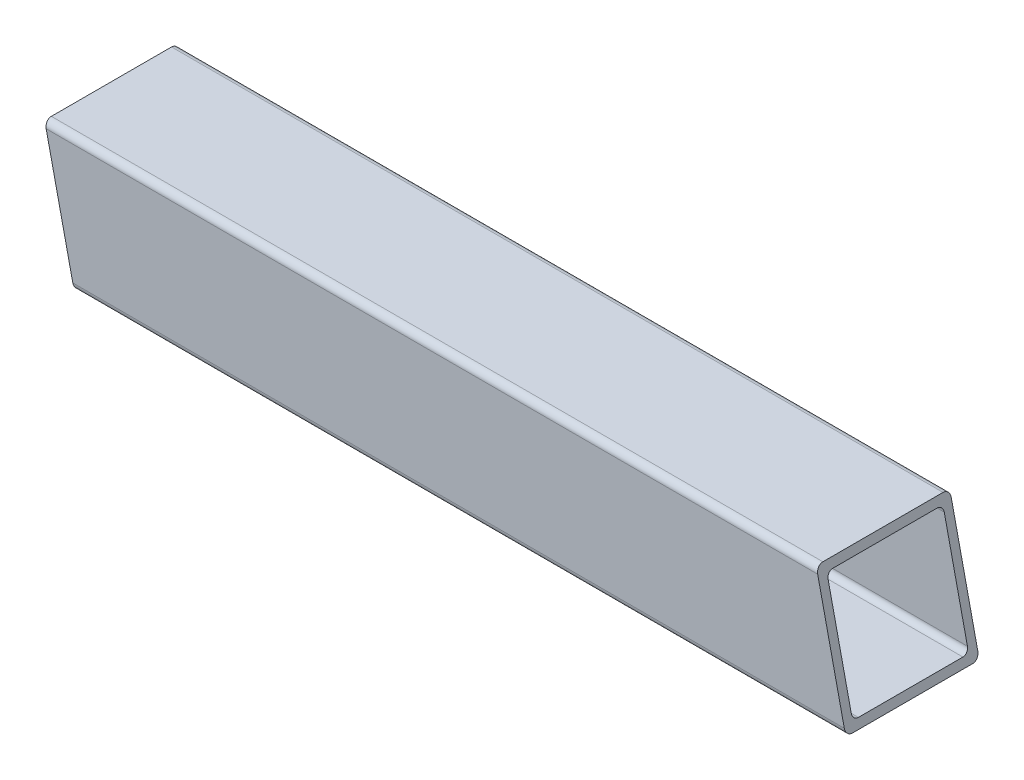
ISO-10303-21;
HEADER;
FILE_DESCRIPTION(('STEP AP214'),'2;1');
FILE_NAME('part.step','',(''),(''),'','','');
FILE_SCHEMA(('AUTOMOTIVE_DESIGN { 1 0 10303 214 1 1 1 1 }'));
ENDSEC;
DATA;
#1=APPLICATION_CONTEXT('core data for automotive mechanical design processes');
#2=APPLICATION_PROTOCOL_DEFINITION('international standard','automotive_design',2000,#1);
#3=PRODUCT_CONTEXT('',#1,'mechanical');
#4=PRODUCT('Part','Part','',(#3));
#5=PRODUCT_RELATED_PRODUCT_CATEGORY('part','',(#4));
#6=PRODUCT_DEFINITION_FORMATION('','',#4);
#7=PRODUCT_DEFINITION_CONTEXT('part definition',#1,'design');
#8=PRODUCT_DEFINITION('design','',#6,#7);
#9=PRODUCT_DEFINITION_SHAPE('','',#8);
#10=(LENGTH_UNIT() NAMED_UNIT(*) SI_UNIT(.MILLI.,.METRE.));
#11=(NAMED_UNIT(*) PLANE_ANGLE_UNIT() SI_UNIT($,.RADIAN.));
#12=(NAMED_UNIT(*) SI_UNIT($,.STERADIAN.) SOLID_ANGLE_UNIT());
#13=UNCERTAINTY_MEASURE_WITH_UNIT(LENGTH_MEASURE(1.E-05),#10,'distance_accuracy_value','');
#14=(GEOMETRIC_REPRESENTATION_CONTEXT(3) GLOBAL_UNCERTAINTY_ASSIGNED_CONTEXT((#13)) GLOBAL_UNIT_ASSIGNED_CONTEXT((#10,
#11,#12)) REPRESENTATION_CONTEXT('',''));
#15=CARTESIAN_POINT('',(0.,0.,0.));
#16=DIRECTION('',(0.,0.,1.));
#17=DIRECTION('',(1.,0.,0.));
#18=AXIS2_PLACEMENT_3D('',#15,#16,#17);
#19=CARTESIAN_POINT('',(76.2,12.7,-11.43));
#20=DIRECTION('',(0.,-1.,0.));
#21=DIRECTION('',(0.,0.,-1.));
#22=AXIS2_PLACEMENT_3D('',#19,#20,#21);
#23=PLANE('',#22);
#24=DIRECTION('',(-1.,0.,0.));
#25=VECTOR('',#24,1.);
#26=CARTESIAN_POINT('',(76.2,12.7,11.43));
#27=LINE('',#26,#25);
#28=CARTESIAN_POINT('',(70.5689555688695,12.7,11.43));
#29=VERTEX_POINT('',#28);
#30=CARTESIAN_POINT('',(-76.2,12.7,11.43));
#31=VERTEX_POINT('',#30);
#32=EDGE_CURVE('E182',#29,#31,#27,.T.);
#33=ORIENTED_EDGE('',*,*,#32,.F.);
#34=DIRECTION('',(0.,0.,1.));
#35=VECTOR('',#34,1.);
#36=CARTESIAN_POINT('',(70.5689555688695,12.7,-12.7));
#37=LINE('',#36,#35);
#38=CARTESIAN_POINT('',(70.5689555688695,12.7,-11.43));
#39=VERTEX_POINT('',#38);
#40=EDGE_CURVE('E273',#39,#29,#37,.T.);
#41=ORIENTED_EDGE('',*,*,#40,.F.);
#42=DIRECTION('',(-1.,0.,0.));
#43=VECTOR('',#42,1.);
#44=CARTESIAN_POINT('',(76.2,12.7,-11.43));
#45=LINE('',#44,#43);
#46=CARTESIAN_POINT('',(-76.2,12.7,-11.43));
#47=VERTEX_POINT('',#46);
#48=EDGE_CURVE('E190',#39,#47,#45,.T.);
#49=ORIENTED_EDGE('',*,*,#48,.T.);
#50=DIRECTION('',(0.,0.,1.));
#51=VECTOR('',#50,1.);
#52=CARTESIAN_POINT('',(-76.2,12.7,-11.43));
#53=LINE('',#52,#51);
#54=EDGE_CURVE('E237',#47,#31,#53,.T.);
#55=ORIENTED_EDGE('',*,*,#54,.T.);
#56=EDGE_LOOP('',(#33,#41,#49,#55));
#57=FACE_BOUND('',#56,.T.);
#58=ADVANCED_FACE('F41',(#57),#23,.F.);
#59=CARTESIAN_POINT('',(76.2,-12.7,-11.43));
#60=DIRECTION('',(0.,1.,0.));
#61=DIRECTION('',(0.,0.,1.));
#62=AXIS2_PLACEMENT_3D('',#59,#60,#61);
#63=PLANE('',#62);
#64=DIRECTION('',(-1.,0.,0.));
#65=VECTOR('',#64,1.);
#66=CARTESIAN_POINT('',(76.2,-12.7,11.43));
#67=LINE('',#66,#65);
#68=CARTESIAN_POINT('',(76.2,-12.7,11.43));
#69=VERTEX_POINT('',#68);
#70=CARTESIAN_POINT('',(-70.5689555688695,-12.7,11.43));
#71=VERTEX_POINT('',#70);
#72=EDGE_CURVE('E180',#69,#71,#67,.T.);
#73=ORIENTED_EDGE('',*,*,#72,.T.);
#74=DIRECTION('',(0.,0.,1.));
#75=VECTOR('',#74,1.);
#76=CARTESIAN_POINT('',(-70.5689555688695,-12.7,-12.7));
#77=LINE('',#76,#75);
#78=CARTESIAN_POINT('',(-70.5689555688695,-12.7,-11.43));
#79=VERTEX_POINT('',#78);
#80=EDGE_CURVE('E158',#79,#71,#77,.T.);
#81=ORIENTED_EDGE('',*,*,#80,.F.);
#82=DIRECTION('',(-1.,0.,0.));
#83=VECTOR('',#82,1.);
#84=CARTESIAN_POINT('',(76.2,-12.7,-11.43));
#85=LINE('',#84,#83);
#86=CARTESIAN_POINT('',(76.2,-12.7,-11.43));
#87=VERTEX_POINT('',#86);
#88=EDGE_CURVE('E184',#87,#79,#85,.T.);
#89=ORIENTED_EDGE('',*,*,#88,.F.);
#90=DIRECTION('',(0.,0.,-1.));
#91=VECTOR('',#90,1.);
#92=CARTESIAN_POINT('',(76.2,-12.7,-11.43));
#93=LINE('',#92,#91);
#94=EDGE_CURVE('E264',#69,#87,#93,.T.);
#95=ORIENTED_EDGE('',*,*,#94,.F.);
#96=EDGE_LOOP('',(#73,#81,#89,#95));
#97=FACE_BOUND('',#96,.T.);
#98=ADVANCED_FACE('F269',(#97),#63,.F.);
#99=CARTESIAN_POINT('',(76.2,-11.43,11.43));
#100=DIRECTION('',(-1.,0.,0.));
#101=DIRECTION('',(0.,0.,1.));
#102=AXIS2_PLACEMENT_3D('',#99,#100,#101);
#103=CYLINDRICAL_SURFACE('',#102,1.27);
#104=ORIENTED_EDGE('',*,*,#72,.F.);
#105=CARTESIAN_POINT('',(75.9184477784435,-11.43,11.43));
#106=DIRECTION('',(-0.976296007119935,-0.216439613938097,0.));
#107=DIRECTION('',(-0.216439613938097,0.976296007119935,0.));
#108=AXIS2_PLACEMENT_3D('',#105,#106,#107);
#109=ELLIPSE('',#108,1.30083498317943,1.27);
#110=CARTESIAN_POINT('',(75.9184477784435,-11.43,12.7));
#111=VERTEX_POINT('',#110);
#112=EDGE_CURVE('E179',#69,#111,#109,.T.);
#113=ORIENTED_EDGE('',*,*,#112,.T.);
#114=DIRECTION('',(-1.,0.,0.));
#115=VECTOR('',#114,1.);
#116=CARTESIAN_POINT('',(76.2,-11.43,12.7));
#117=LINE('',#116,#115);
#118=CARTESIAN_POINT('',(-70.850507790426,-11.43,12.7));
#119=VERTEX_POINT('',#118);
#120=EDGE_CURVE('E171',#111,#119,#117,.T.);
#121=ORIENTED_EDGE('',*,*,#120,.T.);
#122=CARTESIAN_POINT('',(-70.850507790426,-11.43,11.43));
#123=DIRECTION('',(0.976296007119935,0.216439613938097,0.));
#124=DIRECTION('',(-0.216439613938097,0.976296007119935,0.));
#125=AXIS2_PLACEMENT_3D('',#122,#123,#124);
#126=ELLIPSE('',#125,1.30083498317943,1.27);
#127=EDGE_CURVE('E152',#119,#71,#126,.T.);
#128=ORIENTED_EDGE('',*,*,#127,.T.);
#129=EDGE_LOOP('',(#104,#113,#121,#128));
#130=FACE_BOUND('',#129,.T.);
#131=ADVANCED_FACE('F178',(#130),#103,.T.);
#132=CARTESIAN_POINT('',(76.2,-11.43,12.7));
#133=DIRECTION('',(0.,0.,-1.));
#134=DIRECTION('',(-1.,0.,0.));
#135=AXIS2_PLACEMENT_3D('',#132,#133,#134);
#136=PLANE('',#135);
#137=ORIENTED_EDGE('',*,*,#120,.F.);
#138=DIRECTION('',(0.216439613938097,-0.976296007119935,0.));
#139=VECTOR('',#138,1.);
#140=CARTESIAN_POINT('',(70.5689555688695,12.7,12.7));
#141=LINE('',#140,#139);
#142=CARTESIAN_POINT('',(70.850507790426,11.43,12.7));
#143=VERTEX_POINT('',#142);
#144=EDGE_CURVE('E174',#143,#111,#141,.T.);
#145=ORIENTED_EDGE('',*,*,#144,.F.);
#146=DIRECTION('',(-1.,0.,0.));
#147=VECTOR('',#146,1.);
#148=CARTESIAN_POINT('',(76.2,11.43,12.7));
#149=LINE('',#148,#147);
#150=CARTESIAN_POINT('',(-75.9184477784435,11.43,12.7));
#151=VERTEX_POINT('',#150);
#152=EDGE_CURVE('E173',#143,#151,#149,.T.);
#153=ORIENTED_EDGE('',*,*,#152,.T.);
#154=DIRECTION('',(-0.216439613938097,0.976296007119935,0.));
#155=VECTOR('',#154,1.);
#156=CARTESIAN_POINT('',(-76.2,12.7,12.7));
#157=LINE('',#156,#155);
#158=EDGE_CURVE('E155',#119,#151,#157,.T.);
#159=ORIENTED_EDGE('',*,*,#158,.F.);
#160=EDGE_LOOP('',(#137,#145,#153,#159));
#161=FACE_BOUND('',#160,.T.);
#162=ADVANCED_FACE('F169',(#161),#136,.F.);
#163=CARTESIAN_POINT('',(76.2,11.43,11.43));
#164=DIRECTION('',(-1.,0.,0.));
#165=DIRECTION('',(0.,0.,1.));
#166=AXIS2_PLACEMENT_3D('',#163,#164,#165);
#167=CYLINDRICAL_SURFACE('',#166,1.27);
#168=ORIENTED_EDGE('',*,*,#152,.F.);
#169=CARTESIAN_POINT('',(70.850507790426,11.43,11.43));
#170=DIRECTION('',(-0.976296007119935,-0.216439613938097,0.));
#171=DIRECTION('',(-0.216439613938097,0.976296007119935,0.));
#172=AXIS2_PLACEMENT_3D('',#169,#170,#171);
#173=ELLIPSE('',#172,1.30083498317943,1.27);
#174=EDGE_CURVE('E230',#143,#29,#173,.T.);
#175=ORIENTED_EDGE('',*,*,#174,.T.);
#176=ORIENTED_EDGE('',*,*,#32,.T.);
#177=CARTESIAN_POINT('',(-75.9184477784435,11.43,11.43));
#178=DIRECTION('',(0.976296007119935,0.216439613938097,0.));
#179=DIRECTION('',(-0.216439613938097,0.976296007119935,0.));
#180=AXIS2_PLACEMENT_3D('',#177,#178,#179);
#181=ELLIPSE('',#180,1.30083498317943,1.27);
#182=EDGE_CURVE('E163',#31,#151,#181,.T.);
#183=ORIENTED_EDGE('',*,*,#182,.T.);
#184=EDGE_LOOP('',(#168,#175,#176,#183));
#185=FACE_BOUND('',#184,.T.);
#186=ADVANCED_FACE('F290',(#185),#167,.T.);
#187=CARTESIAN_POINT('',(76.2,11.43,-11.43));
#188=DIRECTION('',(-1.,0.,0.));
#189=DIRECTION('',(0.,0.,1.));
#190=AXIS2_PLACEMENT_3D('',#187,#188,#189);
#191=CYLINDRICAL_SURFACE('',#190,1.27);
#192=ORIENTED_EDGE('',*,*,#48,.F.);
#193=CARTESIAN_POINT('',(70.850507790426,11.43,-11.43));
#194=DIRECTION('',(-0.976296007119935,-0.216439613938097,0.));
#195=DIRECTION('',(-0.216439613938097,0.976296007119935,0.));
#196=AXIS2_PLACEMENT_3D('',#193,#194,#195);
#197=ELLIPSE('',#196,1.30083498317942,1.27);
#198=CARTESIAN_POINT('',(70.850507790426,11.43,-12.7));
#199=VERTEX_POINT('',#198);
#200=EDGE_CURVE('E233',#39,#199,#197,.T.);
#201=ORIENTED_EDGE('',*,*,#200,.T.);
#202=DIRECTION('',(-1.,0.,0.));
#203=VECTOR('',#202,1.);
#204=CARTESIAN_POINT('',(76.2,11.43,-12.7));
#205=LINE('',#204,#203);
#206=CARTESIAN_POINT('',(-75.9184477784435,11.43,-12.7));
#207=VERTEX_POINT('',#206);
#208=EDGE_CURVE('E193',#199,#207,#205,.T.);
#209=ORIENTED_EDGE('',*,*,#208,.T.);
#210=CARTESIAN_POINT('',(-75.9184477784435,11.43,-11.43));
#211=DIRECTION('',(0.976296007119935,0.216439613938097,0.));
#212=DIRECTION('',(-0.216439613938097,0.976296007119935,0.));
#213=AXIS2_PLACEMENT_3D('',#210,#211,#212);
#214=ELLIPSE('',#213,1.30083498317942,1.27);
#215=EDGE_CURVE('E211',#207,#47,#214,.T.);
#216=ORIENTED_EDGE('',*,*,#215,.T.);
#217=EDGE_LOOP('',(#192,#201,#209,#216));
#218=FACE_BOUND('',#217,.T.);
#219=ADVANCED_FACE('F295',(#218),#191,.T.);
#220=CARTESIAN_POINT('',(76.2,-11.43,-12.7));
#221=DIRECTION('',(0.,0.,1.));
#222=DIRECTION('',(1.,0.,0.));
#223=AXIS2_PLACEMENT_3D('',#220,#221,#222);
#224=PLANE('',#223);
#225=ORIENTED_EDGE('',*,*,#208,.F.);
#226=DIRECTION('',(0.216439613938097,-0.976296007119935,0.));
#227=VECTOR('',#226,1.);
#228=CARTESIAN_POINT('',(70.5689555688695,12.7,-12.7));
#229=LINE('',#228,#227);
#230=CARTESIAN_POINT('',(75.9184477784435,-11.43,-12.7));
#231=VERTEX_POINT('',#230);
#232=EDGE_CURVE('E202',#199,#231,#229,.T.);
#233=ORIENTED_EDGE('',*,*,#232,.T.);
#234=DIRECTION('',(-1.,0.,0.));
#235=VECTOR('',#234,1.);
#236=CARTESIAN_POINT('',(76.2,-11.43,-12.7));
#237=LINE('',#236,#235);
#238=CARTESIAN_POINT('',(-70.850507790426,-11.43,-12.7));
#239=VERTEX_POINT('',#238);
#240=EDGE_CURVE('E49',#231,#239,#237,.T.);
#241=ORIENTED_EDGE('',*,*,#240,.T.);
#242=DIRECTION('',(-0.216439613938097,0.976296007119935,0.));
#243=VECTOR('',#242,1.);
#244=CARTESIAN_POINT('',(-76.2,12.7,-12.7));
#245=LINE('',#244,#243);
#246=EDGE_CURVE('E175',#239,#207,#245,.T.);
#247=ORIENTED_EDGE('',*,*,#246,.T.);
#248=EDGE_LOOP('',(#225,#233,#241,#247));
#249=FACE_BOUND('',#248,.T.);
#250=ADVANCED_FACE('F201',(#249),#224,.F.);
#251=CARTESIAN_POINT('',(76.2,-11.43,-11.43));
#252=DIRECTION('',(-1.,0.,0.));
#253=DIRECTION('',(0.,0.,1.));
#254=AXIS2_PLACEMENT_3D('',#251,#252,#253);
#255=CYLINDRICAL_SURFACE('',#254,1.27);
#256=ORIENTED_EDGE('',*,*,#240,.F.);
#257=CARTESIAN_POINT('',(75.9184477784435,-11.43,-11.43));
#258=DIRECTION('',(-0.976296007119935,-0.216439613938097,0.));
#259=DIRECTION('',(-0.216439613938097,0.976296007119935,0.));
#260=AXIS2_PLACEMENT_3D('',#257,#258,#259);
#261=ELLIPSE('',#260,1.30083498317943,1.27);
#262=EDGE_CURVE('E207',#231,#87,#261,.T.);
#263=ORIENTED_EDGE('',*,*,#262,.T.);
#264=ORIENTED_EDGE('',*,*,#88,.T.);
#265=CARTESIAN_POINT('',(-70.850507790426,-11.43,-11.43));
#266=DIRECTION('',(0.976296007119935,0.216439613938097,0.));
#267=DIRECTION('',(-0.216439613938097,0.976296007119935,0.));
#268=AXIS2_PLACEMENT_3D('',#265,#266,#267);
#269=ELLIPSE('',#268,1.30083498317943,1.27);
#270=EDGE_CURVE('E209',#79,#239,#269,.T.);
#271=ORIENTED_EDGE('',*,*,#270,.T.);
#272=EDGE_LOOP('',(#256,#263,#264,#271));
#273=FACE_BOUND('',#272,.T.);
#274=ADVANCED_FACE('F43',(#273),#255,.T.);
#275=CARTESIAN_POINT('',(-76.2,12.7,-12.7));
#276=DIRECTION('',(0.976296007119935,0.216439613938097,0.));
#277=DIRECTION('',(-0.216439613938097,0.976296007119935,0.));
#278=AXIS2_PLACEMENT_3D('',#275,#276,#277);
#279=PLANE('',#278);
#280=CARTESIAN_POINT('',(-75.5890316792224,9.9441,-9.9441));
#281=DIRECTION('',(0.976296007119935,0.216439613938097,0.));
#282=DIRECTION('',(-0.216439613938097,0.976296007119935,0.));
#283=AXIS2_PLACEMENT_3D('',#280,#281,#282);
#284=ELLIPSE('',#283,1.1317264353661,1.1049);
#285=CARTESIAN_POINT('',(-75.5890316792224,9.9441,-11.049));
#286=VERTEX_POINT('',#285);
#287=CARTESIAN_POINT('',(-75.8339821119765,11.049,-9.94409999999999));
#288=VERTEX_POINT('',#287);
#289=EDGE_CURVE('E164',#286,#288,#284,.T.);
#290=ORIENTED_EDGE('',*,*,#289,.T.);
#291=DIRECTION('',(0.,0.,1.));
#292=VECTOR('',#291,1.);
#293=CARTESIAN_POINT('',(-75.8339821119765,11.049,-9.9441));
#294=LINE('',#293,#292);
#295=CARTESIAN_POINT('',(-75.8339821119765,11.049,9.94409999999999));
#296=VERTEX_POINT('',#295);
#297=EDGE_CURVE('E287',#288,#296,#294,.T.);
#298=ORIENTED_EDGE('',*,*,#297,.T.);
#299=CARTESIAN_POINT('',(-75.5890316792224,9.94409999999999,9.94409999999999));
#300=DIRECTION('',(0.976296007119935,0.216439613938097,0.));
#301=DIRECTION('',(-0.216439613938097,0.976296007119935,0.));
#302=AXIS2_PLACEMENT_3D('',#299,#300,#301);
#303=ELLIPSE('',#302,1.13172643536611,1.10490000000001);
#304=CARTESIAN_POINT('',(-75.5890316792224,9.9441,11.049));
#305=VERTEX_POINT('',#304);
#306=EDGE_CURVE('E285',#296,#305,#303,.T.);
#307=ORIENTED_EDGE('',*,*,#306,.T.);
#308=DIRECTION('',(0.216439613938097,-0.976296007119935,0.));
#309=VECTOR('',#308,1.);
#310=CARTESIAN_POINT('',(-68.4783065384275,-22.1303083597877,11.049));
#311=LINE('',#310,#309);
#312=CARTESIAN_POINT('',(-71.1799238896472,-9.9441,11.049));
#313=VERTEX_POINT('',#312);
#314=EDGE_CURVE('E283',#305,#313,#311,.T.);
#315=ORIENTED_EDGE('',*,*,#314,.T.);
#316=CARTESIAN_POINT('',(-71.1799238896472,-9.9441,9.9441));
#317=DIRECTION('',(0.976296007119935,0.216439613938097,0.));
#318=DIRECTION('',(-0.216439613938097,0.976296007119935,0.));
#319=AXIS2_PLACEMENT_3D('',#316,#317,#318);
#320=ELLIPSE('',#319,1.1317264353661,1.1049);
#321=CARTESIAN_POINT('',(-70.934973456893,-11.049,9.94409999999999));
#322=VERTEX_POINT('',#321);
#323=EDGE_CURVE('E281',#313,#322,#320,.T.);
#324=ORIENTED_EDGE('',*,*,#323,.T.);
#325=DIRECTION('',(0.,0.,-1.));
#326=VECTOR('',#325,1.);
#327=CARTESIAN_POINT('',(-70.934973456893,-11.049,-9.94409999999999));
#328=LINE('',#327,#326);
#329=CARTESIAN_POINT('',(-70.934973456893,-11.049,-9.94409999999999));
#330=VERTEX_POINT('',#329);
#331=EDGE_CURVE('E279',#322,#330,#328,.T.);
#332=ORIENTED_EDGE('',*,*,#331,.T.);
#333=CARTESIAN_POINT('',(-71.1799238896472,-9.9441,-9.9441));
#334=DIRECTION('',(0.976296007119935,0.216439613938097,0.));
#335=DIRECTION('',(-0.216439613938097,0.976296007119935,0.));
#336=AXIS2_PLACEMENT_3D('',#333,#334,#335);
#337=ELLIPSE('',#336,1.1317264353661,1.1049);
#338=CARTESIAN_POINT('',(-71.1799238896472,-9.9441,-11.049));
#339=VERTEX_POINT('',#338);
#340=EDGE_CURVE('E56',#330,#339,#337,.T.);
#341=ORIENTED_EDGE('',*,*,#340,.T.);
#342=DIRECTION('',(-0.216439613938097,0.976296007119935,0.));
#343=VECTOR('',#342,1.);
#344=CARTESIAN_POINT('',(-68.4783065384275,-22.1303083597877,-11.049));
#345=LINE('',#344,#343);
#346=EDGE_CURVE('E276',#339,#286,#345,.T.);
#347=ORIENTED_EDGE('',*,*,#346,.T.);
#348=EDGE_LOOP('',(#290,#298,#307,#315,#324,#332,#341,#347));
#349=FACE_BOUND('',#348,.T.);
#350=ORIENTED_EDGE('',*,*,#80,.T.);
#351=ORIENTED_EDGE('',*,*,#127,.F.);
#352=ORIENTED_EDGE('',*,*,#158,.T.);
#353=ORIENTED_EDGE('',*,*,#182,.F.);
#354=ORIENTED_EDGE('',*,*,#54,.F.);
#355=ORIENTED_EDGE('',*,*,#215,.F.);
#356=ORIENTED_EDGE('',*,*,#246,.F.);
#357=ORIENTED_EDGE('',*,*,#270,.F.);
#358=EDGE_LOOP('',(#350,#351,#352,#353,#354,#355,#356,#357));
#359=FACE_BOUND('',#358,.T.);
#360=ADVANCED_FACE('F154',(#349,#359),#279,.F.);
#361=CARTESIAN_POINT('',(76.2,9.9441,-9.9441));
#362=DIRECTION('',(-1.,0.,0.));
#363=DIRECTION('',(0.,0.,1.));
#364=AXIS2_PLACEMENT_3D('',#361,#362,#363);
#365=CYLINDRICAL_SURFACE('',#364,1.1049);
#366=CARTESIAN_POINT('',(71.1799238896472,9.9441,-9.9441));
#367=DIRECTION('',(-0.976296007119935,-0.216439613938097,0.));
#368=DIRECTION('',(-0.216439613938097,0.976296007119935,0.));
#369=AXIS2_PLACEMENT_3D('',#366,#367,#368);
#370=ELLIPSE('',#369,1.1317264353661,1.1049);
#371=CARTESIAN_POINT('',(70.934973456893,11.049,-9.94409999999999));
#372=VERTEX_POINT('',#371);
#373=CARTESIAN_POINT('',(71.1799238896472,9.9441,-11.049));
#374=VERTEX_POINT('',#373);
#375=EDGE_CURVE('E63',#372,#374,#370,.T.);
#376=ORIENTED_EDGE('',*,*,#375,.F.);
#377=DIRECTION('',(-1.,0.,0.));
#378=VECTOR('',#377,1.);
#379=CARTESIAN_POINT('',(76.2,11.049,-9.94409999999999));
#380=LINE('',#379,#378);
#381=EDGE_CURVE('E261',#372,#288,#380,.T.);
#382=ORIENTED_EDGE('',*,*,#381,.T.);
#383=ORIENTED_EDGE('',*,*,#289,.F.);
#384=DIRECTION('',(-1.,0.,0.));
#385=VECTOR('',#384,1.);
#386=CARTESIAN_POINT('',(76.2,9.9441,-11.049));
#387=LINE('',#386,#385);
#388=EDGE_CURVE('E240',#374,#286,#387,.T.);
#389=ORIENTED_EDGE('',*,*,#388,.F.);
#390=EDGE_LOOP('',(#376,#382,#383,#389));
#391=FACE_BOUND('',#390,.T.);
#392=ADVANCED_FACE('F315',(#391),#365,.F.);
#393=CARTESIAN_POINT('',(76.2,11.049,-9.94409999999999));
#394=DIRECTION('',(0.,-1.,0.));
#395=DIRECTION('',(0.,0.,-1.));
#396=AXIS2_PLACEMENT_3D('',#393,#394,#395);
#397=PLANE('',#396);
#398=DIRECTION('',(0.,0.,-1.));
#399=VECTOR('',#398,1.);
#400=CARTESIAN_POINT('',(70.934973456893,11.049,-9.94409999999999));
#401=LINE('',#400,#399);
#402=CARTESIAN_POINT('',(70.934973456893,11.049,9.94409999999999));
#403=VERTEX_POINT('',#402);
#404=EDGE_CURVE('E226',#403,#372,#401,.T.);
#405=ORIENTED_EDGE('',*,*,#404,.F.);
#406=DIRECTION('',(-1.,0.,0.));
#407=VECTOR('',#406,1.);
#408=CARTESIAN_POINT('',(76.2,11.049,9.94409999999999));
#409=LINE('',#408,#407);
#410=EDGE_CURVE('E258',#403,#296,#409,.T.);
#411=ORIENTED_EDGE('',*,*,#410,.T.);
#412=ORIENTED_EDGE('',*,*,#297,.F.);
#413=ORIENTED_EDGE('',*,*,#381,.F.);
#414=EDGE_LOOP('',(#405,#411,#412,#413));
#415=FACE_BOUND('',#414,.T.);
#416=ADVANCED_FACE('F320',(#415),#397,.T.);
#417=CARTESIAN_POINT('',(76.2,9.94409999999999,9.94409999999999));
#418=DIRECTION('',(-1.,0.,0.));
#419=DIRECTION('',(0.,0.,1.));
#420=AXIS2_PLACEMENT_3D('',#417,#418,#419);
#421=CYLINDRICAL_SURFACE('',#420,1.10490000000001);
#422=CARTESIAN_POINT('',(71.1799238896472,9.94409999999999,9.94409999999999));
#423=DIRECTION('',(-0.976296007119935,-0.216439613938097,0.));
#424=DIRECTION('',(-0.216439613938097,0.976296007119935,0.));
#425=AXIS2_PLACEMENT_3D('',#422,#423,#424);
#426=ELLIPSE('',#425,1.13172643536611,1.10490000000001);
#427=CARTESIAN_POINT('',(71.1799238896472,9.94409999999999,11.049));
#428=VERTEX_POINT('',#427);
#429=EDGE_CURVE('E224',#428,#403,#426,.T.);
#430=ORIENTED_EDGE('',*,*,#429,.F.);
#431=DIRECTION('',(-1.,0.,0.));
#432=VECTOR('',#431,1.);
#433=CARTESIAN_POINT('',(76.2,9.94409999999999,11.049));
#434=LINE('',#433,#432);
#435=EDGE_CURVE('E255',#428,#305,#434,.T.);
#436=ORIENTED_EDGE('',*,*,#435,.T.);
#437=ORIENTED_EDGE('',*,*,#306,.F.);
#438=ORIENTED_EDGE('',*,*,#410,.F.);
#439=EDGE_LOOP('',(#430,#436,#437,#438));
#440=FACE_BOUND('',#439,.T.);
#441=ADVANCED_FACE('F344',(#440),#421,.F.);
#442=CARTESIAN_POINT('',(76.2,9.94409999999999,11.049));
#443=DIRECTION('',(0.,0.,-1.));
#444=DIRECTION('',(0.,1.,0.));
#445=AXIS2_PLACEMENT_3D('',#442,#443,#444);
#446=PLANE('',#445);
#447=DIRECTION('',(-0.216439613938097,0.976296007119935,0.));
#448=VECTOR('',#447,1.);
#449=CARTESIAN_POINT('',(71.4150949096589,8.88331208021836,11.049));
#450=LINE('',#449,#448);
#451=CARTESIAN_POINT('',(75.5890316792224,-9.9441,11.049));
#452=VERTEX_POINT('',#451);
#453=EDGE_CURVE('E222',#452,#428,#450,.T.);
#454=ORIENTED_EDGE('',*,*,#453,.F.);
#455=DIRECTION('',(-1.,0.,0.));
#456=VECTOR('',#455,1.);
#457=CARTESIAN_POINT('',(76.2,-9.9441,11.049));
#458=LINE('',#457,#456);
#459=EDGE_CURVE('E252',#452,#313,#458,.T.);
#460=ORIENTED_EDGE('',*,*,#459,.T.);
#461=ORIENTED_EDGE('',*,*,#314,.F.);
#462=ORIENTED_EDGE('',*,*,#435,.F.);
#463=EDGE_LOOP('',(#454,#460,#461,#462));
#464=FACE_BOUND('',#463,.T.);
#465=ADVANCED_FACE('F340',(#464),#446,.T.);
#466=CARTESIAN_POINT('',(76.2,-9.9441,9.9441));
#467=DIRECTION('',(-1.,0.,0.));
#468=DIRECTION('',(0.,0.,1.));
#469=AXIS2_PLACEMENT_3D('',#466,#467,#468);
#470=CYLINDRICAL_SURFACE('',#469,1.1049);
#471=CARTESIAN_POINT('',(75.5890316792224,-9.9441,9.9441));
#472=DIRECTION('',(-0.976296007119935,-0.216439613938097,0.));
#473=DIRECTION('',(-0.216439613938097,0.976296007119935,0.));
#474=AXIS2_PLACEMENT_3D('',#471,#472,#473);
#475=ELLIPSE('',#474,1.1317264353661,1.1049);
#476=CARTESIAN_POINT('',(75.8339821119765,-11.049,9.94409999999999));
#477=VERTEX_POINT('',#476);
#478=EDGE_CURVE('E220',#477,#452,#475,.T.);
#479=ORIENTED_EDGE('',*,*,#478,.F.);
#480=DIRECTION('',(-1.,0.,0.));
#481=VECTOR('',#480,1.);
#482=CARTESIAN_POINT('',(76.2,-11.049,9.94409999999999));
#483=LINE('',#482,#481);
#484=EDGE_CURVE('E249',#477,#322,#483,.T.);
#485=ORIENTED_EDGE('',*,*,#484,.T.);
#486=ORIENTED_EDGE('',*,*,#323,.F.);
#487=ORIENTED_EDGE('',*,*,#459,.F.);
#488=EDGE_LOOP('',(#479,#485,#486,#487));
#489=FACE_BOUND('',#488,.T.);
#490=ADVANCED_FACE('F336',(#489),#470,.F.);
#491=CARTESIAN_POINT('',(76.2,-11.049,-9.94409999999999));
#492=DIRECTION('',(0.,1.,0.));
#493=DIRECTION('',(0.,0.,1.));
#494=AXIS2_PLACEMENT_3D('',#491,#492,#493);
#495=PLANE('',#494);
#496=DIRECTION('',(0.,0.,1.));
#497=VECTOR('',#496,1.);
#498=CARTESIAN_POINT('',(75.8339821119765,-11.049,-9.94409999999999));
#499=LINE('',#498,#497);
#500=CARTESIAN_POINT('',(75.8339821119765,-11.049,-9.94409999999999));
#501=VERTEX_POINT('',#500);
#502=EDGE_CURVE('E213',#501,#477,#499,.T.);
#503=ORIENTED_EDGE('',*,*,#502,.F.);
#504=DIRECTION('',(-1.,0.,0.));
#505=VECTOR('',#504,1.);
#506=CARTESIAN_POINT('',(76.2,-11.049,-9.94409999999999));
#507=LINE('',#506,#505);
#508=EDGE_CURVE('E246',#501,#330,#507,.T.);
#509=ORIENTED_EDGE('',*,*,#508,.T.);
#510=ORIENTED_EDGE('',*,*,#331,.F.);
#511=ORIENTED_EDGE('',*,*,#484,.F.);
#512=EDGE_LOOP('',(#503,#509,#510,#511));
#513=FACE_BOUND('',#512,.T.);
#514=ADVANCED_FACE('F332',(#513),#495,.T.);
#515=CARTESIAN_POINT('',(76.2,-9.9441,-9.9441));
#516=DIRECTION('',(-1.,0.,0.));
#517=DIRECTION('',(0.,0.,1.));
#518=AXIS2_PLACEMENT_3D('',#515,#516,#517);
#519=CYLINDRICAL_SURFACE('',#518,1.1049);
#520=CARTESIAN_POINT('',(75.5890316792224,-9.9441,-9.9441));
#521=DIRECTION('',(-0.976296007119935,-0.216439613938097,0.));
#522=DIRECTION('',(-0.216439613938097,0.976296007119935,0.));
#523=AXIS2_PLACEMENT_3D('',#520,#521,#522);
#524=ELLIPSE('',#523,1.1317264353661,1.1049);
#525=CARTESIAN_POINT('',(75.5890316792224,-9.9441,-11.049));
#526=VERTEX_POINT('',#525);
#527=EDGE_CURVE('E210',#526,#501,#524,.T.);
#528=ORIENTED_EDGE('',*,*,#527,.F.);
#529=DIRECTION('',(-1.,0.,0.));
#530=VECTOR('',#529,1.);
#531=CARTESIAN_POINT('',(76.2,-9.9441,-11.049));
#532=LINE('',#531,#530);
#533=EDGE_CURVE('E243',#526,#339,#532,.T.);
#534=ORIENTED_EDGE('',*,*,#533,.T.);
#535=ORIENTED_EDGE('',*,*,#340,.F.);
#536=ORIENTED_EDGE('',*,*,#508,.F.);
#537=EDGE_LOOP('',(#528,#534,#535,#536));
#538=FACE_BOUND('',#537,.T.);
#539=ADVANCED_FACE('F328',(#538),#519,.F.);
#540=CARTESIAN_POINT('',(76.2,9.9441,-11.049));
#541=DIRECTION('',(0.,0.,1.));
#542=DIRECTION('',(1.,0.,0.));
#543=AXIS2_PLACEMENT_3D('',#540,#541,#542);
#544=PLANE('',#543);
#545=DIRECTION('',(0.216439613938097,-0.976296007119935,0.));
#546=VECTOR('',#545,1.);
#547=CARTESIAN_POINT('',(71.4150949096589,8.88331208021836,-11.049));
#548=LINE('',#547,#546);
#549=EDGE_CURVE('E11',#374,#526,#548,.T.);
#550=ORIENTED_EDGE('',*,*,#549,.F.);
#551=ORIENTED_EDGE('',*,*,#388,.T.);
#552=ORIENTED_EDGE('',*,*,#346,.F.);
#553=ORIENTED_EDGE('',*,*,#533,.F.);
#554=EDGE_LOOP('',(#550,#551,#552,#553));
#555=FACE_BOUND('',#554,.T.);
#556=ADVANCED_FACE('F325',(#555),#544,.T.);
#557=CARTESIAN_POINT('',(70.5689555688695,12.7,-12.7));
#558=DIRECTION('',(-0.976296007119935,-0.216439613938097,0.));
#559=DIRECTION('',(0.216439613938097,-0.976296007119935,0.));
#560=AXIS2_PLACEMENT_3D('',#557,#558,#559);
#561=PLANE('',#560);
#562=ORIENTED_EDGE('',*,*,#375,.T.);
#563=ORIENTED_EDGE('',*,*,#549,.T.);
#564=ORIENTED_EDGE('',*,*,#527,.T.);
#565=ORIENTED_EDGE('',*,*,#502,.T.);
#566=ORIENTED_EDGE('',*,*,#478,.T.);
#567=ORIENTED_EDGE('',*,*,#453,.T.);
#568=ORIENTED_EDGE('',*,*,#429,.T.);
#569=ORIENTED_EDGE('',*,*,#404,.T.);
#570=EDGE_LOOP('',(#562,#563,#564,#565,#566,#567,#568,#569));
#571=FACE_BOUND('',#570,.T.);
#572=ORIENTED_EDGE('',*,*,#232,.F.);
#573=ORIENTED_EDGE('',*,*,#200,.F.);
#574=ORIENTED_EDGE('',*,*,#40,.T.);
#575=ORIENTED_EDGE('',*,*,#174,.F.);
#576=ORIENTED_EDGE('',*,*,#144,.T.);
#577=ORIENTED_EDGE('',*,*,#112,.F.);
#578=ORIENTED_EDGE('',*,*,#94,.T.);
#579=ORIENTED_EDGE('',*,*,#262,.F.);
#580=EDGE_LOOP('',(#572,#573,#574,#575,#576,#577,#578,#579));
#581=FACE_BOUND('',#580,.T.);
#582=ADVANCED_FACE('F267',(#571,#581),#561,.F.);
#583=CLOSED_SHELL('',(#58,#98,#131,#162,#186,#219,#250,#274,#360,#392,#416,#441,#465,#490,#514,
#539,#556,#582));
#584=MANIFOLD_SOLID_BREP('B2',#583);
#585=ADVANCED_BREP_SHAPE_REPRESENTATION('',(#18,#584),#14);
#586=SHAPE_DEFINITION_REPRESENTATION(#9,#585);
ENDSEC;
END-ISO-10303-21;
